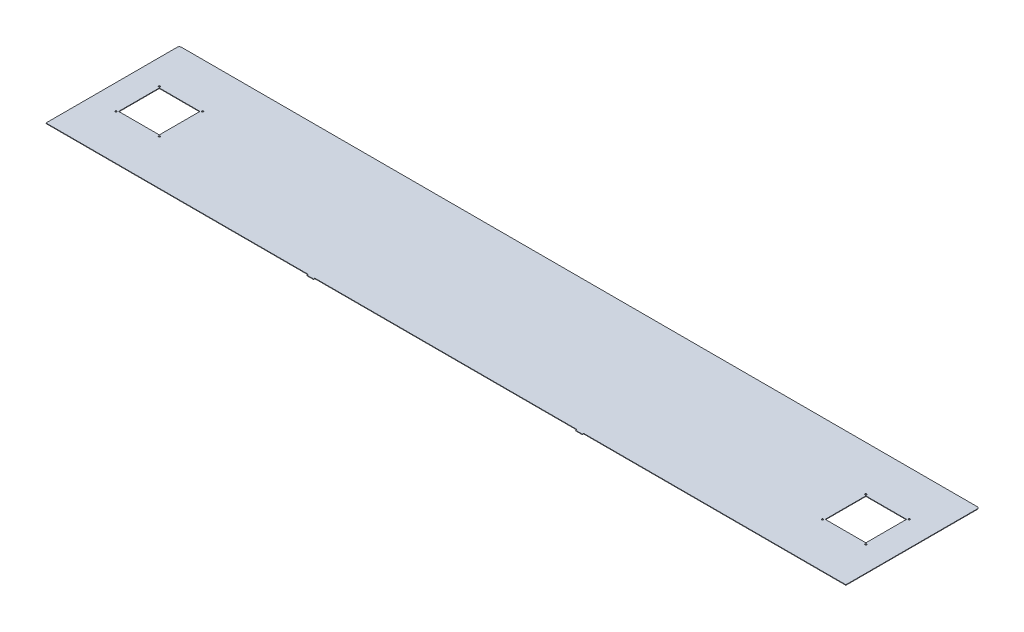
ISO-10303-21;
HEADER;
FILE_DESCRIPTION(('STEP AP214'),'2;1');
FILE_NAME('part.step','',(''),(''),'','','');
FILE_SCHEMA(('AUTOMOTIVE_DESIGN { 1 0 10303 214 1 1 1 1 }'));
ENDSEC;
DATA;
#1=APPLICATION_CONTEXT('core data for automotive mechanical design processes');
#2=APPLICATION_PROTOCOL_DEFINITION('international standard','automotive_design',2000,#1);
#3=PRODUCT_CONTEXT('',#1,'mechanical');
#4=PRODUCT('Part','Part','',(#3));
#5=PRODUCT_RELATED_PRODUCT_CATEGORY('part','',(#4));
#6=PRODUCT_DEFINITION_FORMATION('','',#4);
#7=PRODUCT_DEFINITION_CONTEXT('part definition',#1,'design');
#8=PRODUCT_DEFINITION('design','',#6,#7);
#9=PRODUCT_DEFINITION_SHAPE('','',#8);
#10=(LENGTH_UNIT() NAMED_UNIT(*) SI_UNIT(.MILLI.,.METRE.));
#11=(NAMED_UNIT(*) PLANE_ANGLE_UNIT() SI_UNIT($,.RADIAN.));
#12=(NAMED_UNIT(*) SI_UNIT($,.STERADIAN.) SOLID_ANGLE_UNIT());
#13=UNCERTAINTY_MEASURE_WITH_UNIT(LENGTH_MEASURE(1.E-05),#10,'distance_accuracy_value','');
#14=(GEOMETRIC_REPRESENTATION_CONTEXT(3) GLOBAL_UNCERTAINTY_ASSIGNED_CONTEXT((#13)) GLOBAL_UNIT_ASSIGNED_CONTEXT((#10,
#11,#12)) REPRESENTATION_CONTEXT('',''));
#15=CARTESIAN_POINT('',(0.,0.,0.));
#16=DIRECTION('',(0.,0.,1.));
#17=DIRECTION('',(1.,0.,0.));
#18=AXIS2_PLACEMENT_3D('',#15,#16,#17);
#19=CARTESIAN_POINT('',(-1200.,-1.51,-500.));
#20=DIRECTION('',(0.,0.,1.));
#21=DIRECTION('',(1.,0.,0.));
#22=AXIS2_PLACEMENT_3D('',#19,#20,#21);
#23=PLANE('',#22);
#24=DIRECTION('',(0.,1.,0.));
#25=VECTOR('',#24,1.);
#26=CARTESIAN_POINT('',(-393.333333333334,-1.5,-500.));
#27=LINE('',#26,#25);
#28=CARTESIAN_POINT('',(-393.333333333334,-1.5,-500.));
#29=VERTEX_POINT('',#28);
#30=CARTESIAN_POINT('',(-393.333333333334,0.,-500.));
#31=VERTEX_POINT('',#30);
#32=EDGE_CURVE('E191',#29,#31,#27,.T.);
#33=ORIENTED_EDGE('',*,*,#32,.F.);
#34=DIRECTION('',(1.,0.,0.));
#35=VECTOR('',#34,1.);
#36=CARTESIAN_POINT('',(0.,-1.5,-500.));
#37=LINE('',#36,#35);
#38=CARTESIAN_POINT('',(393.333333333333,-1.5,-500.));
#39=VERTEX_POINT('',#38);
#40=EDGE_CURVE('E202',#29,#39,#37,.T.);
#41=ORIENTED_EDGE('',*,*,#40,.T.);
#42=DIRECTION('',(0.,1.,0.));
#43=VECTOR('',#42,1.);
#44=CARTESIAN_POINT('',(393.333333333333,-1.5,-500.));
#45=LINE('',#44,#43);
#46=CARTESIAN_POINT('',(393.333333333333,0.,-500.));
#47=VERTEX_POINT('',#46);
#48=EDGE_CURVE('E565',#39,#47,#45,.T.);
#49=ORIENTED_EDGE('',*,*,#48,.T.);
#50=DIRECTION('',(1.,0.,0.));
#51=VECTOR('',#50,1.);
#52=CARTESIAN_POINT('',(0.,0.,-500.));
#53=LINE('',#52,#51);
#54=EDGE_CURVE('E60',#31,#47,#53,.T.);
#55=ORIENTED_EDGE('',*,*,#54,.F.);
#56=EDGE_LOOP('',(#33,#41,#49,#55));
#57=FACE_BOUND('',#56,.T.);
#58=ADVANCED_FACE('F40',(#57),#23,.T.);
#59=DIRECTION('',(0.,1.,0.));
#60=VECTOR('',#59,1.);
#61=CARTESIAN_POINT('',(-413.333333333334,-1.5,-500.));
#62=LINE('',#61,#60);
#63=CARTESIAN_POINT('',(-413.333333333334,-1.5,-500.));
#64=VERTEX_POINT('',#63);
#65=CARTESIAN_POINT('',(-413.333333333334,0.,-500.));
#66=VERTEX_POINT('',#65);
#67=EDGE_CURVE('E204',#64,#66,#62,.T.);
#68=ORIENTED_EDGE('',*,*,#67,.T.);
#69=CARTESIAN_POINT('',(-1200.,0.,-500.));
#70=VERTEX_POINT('',#69);
#71=EDGE_CURVE('E273',#70,#66,#53,.T.);
#72=ORIENTED_EDGE('',*,*,#71,.F.);
#73=DIRECTION('',(0.,1.,0.));
#74=VECTOR('',#73,1.);
#75=CARTESIAN_POINT('',(-1200.,-1.5,-500.));
#76=LINE('',#75,#74);
#77=CARTESIAN_POINT('',(-1200.,-1.5,-500.));
#78=VERTEX_POINT('',#77);
#79=EDGE_CURVE('E277',#78,#70,#76,.T.);
#80=ORIENTED_EDGE('',*,*,#79,.F.);
#81=EDGE_CURVE('E213',#78,#64,#37,.T.);
#82=ORIENTED_EDGE('',*,*,#81,.T.);
#83=EDGE_LOOP('',(#68,#72,#80,#82));
#84=FACE_BOUND('',#83,.T.);
#85=ADVANCED_FACE('F410',(#84),#23,.T.);
#86=DIRECTION('',(0.,1.,0.));
#87=VECTOR('',#86,1.);
#88=CARTESIAN_POINT('',(413.333333333333,-1.5,-500.));
#89=LINE('',#88,#87);
#90=CARTESIAN_POINT('',(413.333333333333,-1.5,-500.));
#91=VERTEX_POINT('',#90);
#92=CARTESIAN_POINT('',(413.333333333333,0.,-500.));
#93=VERTEX_POINT('',#92);
#94=EDGE_CURVE('E555',#91,#93,#89,.T.);
#95=ORIENTED_EDGE('',*,*,#94,.F.);
#96=CARTESIAN_POINT('',(1200.,-1.5,-500.));
#97=VERTEX_POINT('',#96);
#98=EDGE_CURVE('E214',#91,#97,#37,.T.);
#99=ORIENTED_EDGE('',*,*,#98,.T.);
#100=DIRECTION('',(0.,-1.,0.));
#101=VECTOR('',#100,1.);
#102=CARTESIAN_POINT('',(1200.,-1.5,-500.));
#103=LINE('',#102,#101);
#104=CARTESIAN_POINT('',(1200.,0.,-500.));
#105=VERTEX_POINT('',#104);
#106=EDGE_CURVE('E217',#105,#97,#103,.T.);
#107=ORIENTED_EDGE('',*,*,#106,.F.);
#108=EDGE_CURVE('E276',#93,#105,#53,.T.);
#109=ORIENTED_EDGE('',*,*,#108,.F.);
#110=EDGE_LOOP('',(#95,#99,#107,#109));
#111=FACE_BOUND('',#110,.T.);
#112=ADVANCED_FACE('F411',(#111),#23,.T.);
#113=CARTESIAN_POINT('',(0.,-1.5,0.));
#114=DIRECTION('',(0.,1.,0.));
#115=DIRECTION('',(0.,0.,1.));
#116=AXIS2_PLACEMENT_3D('',#113,#114,#115);
#117=PLANE('',#116);
#118=DIRECTION('',(1.,0.,0.));
#119=VECTOR('',#118,1.);
#120=CARTESIAN_POINT('',(0.,-1.5,-761.));
#121=LINE('',#120,#119);
#122=CARTESIAN_POINT('',(1121.,-1.5,-761.));
#123=VERTEX_POINT('',#122);
#124=CARTESIAN_POINT('',(998.999999999999,-1.5,-761.));
#125=VERTEX_POINT('',#124);
#126=EDGE_CURVE('E243',#123,#125,#121,.F.);
#127=ORIENTED_EDGE('',*,*,#126,.T.);
#128=DIRECTION('',(0.,0.,1.));
#129=VECTOR('',#128,1.);
#130=CARTESIAN_POINT('',(998.999999999999,-1.5,0.));
#131=LINE('',#130,#129);
#132=CARTESIAN_POINT('',(998.999999999999,-1.5,-639.));
#133=VERTEX_POINT('',#132);
#134=EDGE_CURVE('E240',#125,#133,#131,.T.);
#135=ORIENTED_EDGE('',*,*,#134,.T.);
#136=DIRECTION('',(1.,0.,0.));
#137=VECTOR('',#136,1.);
#138=CARTESIAN_POINT('',(0.,-1.5,-639.));
#139=LINE('',#138,#137);
#140=CARTESIAN_POINT('',(1121.,-1.5,-639.));
#141=VERTEX_POINT('',#140);
#142=EDGE_CURVE('E256',#133,#141,#139,.T.);
#143=ORIENTED_EDGE('',*,*,#142,.T.);
#144=DIRECTION('',(0.,0.,1.));
#145=VECTOR('',#144,1.);
#146=CARTESIAN_POINT('',(1121.,-1.5,0.));
#147=LINE('',#146,#145);
#148=EDGE_CURVE('E250',#141,#123,#147,.F.);
#149=ORIENTED_EDGE('',*,*,#148,.T.);
#150=EDGE_LOOP('',(#127,#135,#143,#149));
#151=FACE_BOUND('',#150,.T.);
#152=DIRECTION('',(1.,0.,0.));
#153=VECTOR('',#152,1.);
#154=CARTESIAN_POINT('',(0.,-1.5,-761.));
#155=LINE('',#154,#153);
#156=CARTESIAN_POINT('',(-999.,-1.5,-761.));
#157=VERTEX_POINT('',#156);
#158=CARTESIAN_POINT('',(-1121.,-1.5,-761.));
#159=VERTEX_POINT('',#158);
#160=EDGE_CURVE('E262',#157,#159,#155,.F.);
#161=ORIENTED_EDGE('',*,*,#160,.T.);
#162=DIRECTION('',(0.,0.,1.));
#163=VECTOR('',#162,1.);
#164=CARTESIAN_POINT('',(-1121.,-1.5,0.));
#165=LINE('',#164,#163);
#166=CARTESIAN_POINT('',(-1121.,-1.5,-639.));
#167=VERTEX_POINT('',#166);
#168=EDGE_CURVE('E259',#159,#167,#165,.T.);
#169=ORIENTED_EDGE('',*,*,#168,.T.);
#170=DIRECTION('',(1.,0.,0.));
#171=VECTOR('',#170,1.);
#172=CARTESIAN_POINT('',(0.,-1.5,-639.));
#173=LINE('',#172,#171);
#174=CARTESIAN_POINT('',(-999.,-1.5,-639.));
#175=VERTEX_POINT('',#174);
#176=EDGE_CURVE('E269',#167,#175,#173,.T.);
#177=ORIENTED_EDGE('',*,*,#176,.T.);
#178=DIRECTION('',(0.,0.,1.));
#179=VECTOR('',#178,1.);
#180=CARTESIAN_POINT('',(-999.,-1.5,0.));
#181=LINE('',#180,#179);
#182=EDGE_CURVE('E263',#175,#157,#181,.F.);
#183=ORIENTED_EDGE('',*,*,#182,.T.);
#184=EDGE_LOOP('',(#161,#169,#177,#183));
#185=FACE_BOUND('',#184,.T.);
#186=CARTESIAN_POINT('',(1125.,-1.5,-765.));
#187=DIRECTION('',(0.,1.,0.));
#188=DIRECTION('',(0.,0.,1.));
#189=AXIS2_PLACEMENT_3D('',#186,#187,#188);
#190=CIRCLE('',#189,2.49999999999995);
#191=CARTESIAN_POINT('',(1125.,-1.5,-762.5));
#192=VERTEX_POINT('',#191);
#193=EDGE_CURVE('E272',#192,#192,#190,.T.);
#194=ORIENTED_EDGE('',*,*,#193,.T.);
#195=EDGE_LOOP('',(#194));
#196=FACE_BOUND('',#195,.T.);
#197=CARTESIAN_POINT('',(1125.,-1.5,-635.));
#198=DIRECTION('',(0.,1.,0.));
#199=DIRECTION('',(0.,0.,1.));
#200=AXIS2_PLACEMENT_3D('',#197,#198,#199);
#201=CIRCLE('',#200,2.49999999999995);
#202=CARTESIAN_POINT('',(1125.,-1.5,-632.5));
#203=VERTEX_POINT('',#202);
#204=EDGE_CURVE('E320',#203,#203,#201,.T.);
#205=ORIENTED_EDGE('',*,*,#204,.T.);
#206=EDGE_LOOP('',(#205));
#207=FACE_BOUND('',#206,.T.);
#208=CARTESIAN_POINT('',(995.,-1.5,-635.));
#209=DIRECTION('',(0.,1.,0.));
#210=DIRECTION('',(0.,0.,1.));
#211=AXIS2_PLACEMENT_3D('',#208,#209,#210);
#212=CIRCLE('',#211,2.49999999999995);
#213=CARTESIAN_POINT('',(995.,-1.5,-632.5));
#214=VERTEX_POINT('',#213);
#215=EDGE_CURVE('E323',#214,#214,#212,.T.);
#216=ORIENTED_EDGE('',*,*,#215,.T.);
#217=EDGE_LOOP('',(#216));
#218=FACE_BOUND('',#217,.T.);
#219=CARTESIAN_POINT('',(995.,-1.5,-765.));
#220=DIRECTION('',(0.,1.,0.));
#221=DIRECTION('',(0.,0.,1.));
#222=AXIS2_PLACEMENT_3D('',#219,#220,#221);
#223=CIRCLE('',#222,2.49999999999995);
#224=CARTESIAN_POINT('',(995.,-1.5,-762.5));
#225=VERTEX_POINT('',#224);
#226=EDGE_CURVE('E326',#225,#225,#223,.T.);
#227=ORIENTED_EDGE('',*,*,#226,.T.);
#228=EDGE_LOOP('',(#227));
#229=FACE_BOUND('',#228,.T.);
#230=CARTESIAN_POINT('',(-995.,-1.5,-634.999999999999));
#231=DIRECTION('',(0.,1.,0.));
#232=DIRECTION('',(0.,0.,1.));
#233=AXIS2_PLACEMENT_3D('',#230,#231,#232);
#234=CIRCLE('',#233,2.49999999999995);
#235=CARTESIAN_POINT('',(-995.,-1.5,-632.499999999999));
#236=VERTEX_POINT('',#235);
#237=EDGE_CURVE('E329',#236,#236,#234,.T.);
#238=ORIENTED_EDGE('',*,*,#237,.T.);
#239=EDGE_LOOP('',(#238));
#240=FACE_BOUND('',#239,.T.);
#241=CARTESIAN_POINT('',(-995.,-1.5,-764.999999999999));
#242=DIRECTION('',(0.,1.,0.));
#243=DIRECTION('',(0.,0.,1.));
#244=AXIS2_PLACEMENT_3D('',#241,#242,#243);
#245=CIRCLE('',#244,2.49999999999995);
#246=CARTESIAN_POINT('',(-995.,-1.5,-762.499999999999));
#247=VERTEX_POINT('',#246);
#248=EDGE_CURVE('E332',#247,#247,#245,.T.);
#249=ORIENTED_EDGE('',*,*,#248,.T.);
#250=EDGE_LOOP('',(#249));
#251=FACE_BOUND('',#250,.T.);
#252=CARTESIAN_POINT('',(-1125.,-1.5,-764.999999999999));
#253=DIRECTION('',(0.,1.,0.));
#254=DIRECTION('',(0.,0.,1.));
#255=AXIS2_PLACEMENT_3D('',#252,#253,#254);
#256=CIRCLE('',#255,2.49999999999995);
#257=CARTESIAN_POINT('',(-1125.,-1.5,-762.499999999999));
#258=VERTEX_POINT('',#257);
#259=EDGE_CURVE('E335',#258,#258,#256,.T.);
#260=ORIENTED_EDGE('',*,*,#259,.T.);
#261=EDGE_LOOP('',(#260));
#262=FACE_BOUND('',#261,.T.);
#263=CARTESIAN_POINT('',(-1125.,-1.5,-634.999999999999));
#264=DIRECTION('',(0.,1.,0.));
#265=DIRECTION('',(0.,0.,1.));
#266=AXIS2_PLACEMENT_3D('',#263,#264,#265);
#267=CIRCLE('',#266,2.49999999999995);
#268=CARTESIAN_POINT('',(-1125.,-1.5,-632.499999999999));
#269=VERTEX_POINT('',#268);
#270=EDGE_CURVE('E228',#269,#269,#267,.T.);
#271=ORIENTED_EDGE('',*,*,#270,.T.);
#272=EDGE_LOOP('',(#271));
#273=FACE_BOUND('',#272,.T.);
#274=ORIENTED_EDGE('',*,*,#81,.F.);
#275=DIRECTION('',(0.,0.,1.));
#276=VECTOR('',#275,1.);
#277=CARTESIAN_POINT('',(-1200.,-1.5,-900.));
#278=LINE('',#277,#276);
#279=CARTESIAN_POINT('',(-1200.,-1.5,-894.));
#280=VERTEX_POINT('',#279);
#281=EDGE_CURVE('E230',#280,#78,#278,.T.);
#282=ORIENTED_EDGE('',*,*,#281,.F.);
#283=CARTESIAN_POINT('',(-1194.,-1.5,-894.));
#284=DIRECTION('',(0.,1.,0.));
#285=DIRECTION('',(0.,0.,1.));
#286=AXIS2_PLACEMENT_3D('',#283,#284,#285);
#287=CIRCLE('',#286,6.00000000000001);
#288=CARTESIAN_POINT('',(-1194.,-1.5,-900.));
#289=VERTEX_POINT('',#288);
#290=EDGE_CURVE('E232',#289,#280,#287,.T.);
#291=ORIENTED_EDGE('',*,*,#290,.F.);
#292=DIRECTION('',(-1.,0.,0.));
#293=VECTOR('',#292,1.);
#294=CARTESIAN_POINT('',(-1200.,-1.5,-900.));
#295=LINE('',#294,#293);
#296=CARTESIAN_POINT('',(1194.,-1.5,-900.));
#297=VERTEX_POINT('',#296);
#298=EDGE_CURVE('E294',#297,#289,#295,.T.);
#299=ORIENTED_EDGE('',*,*,#298,.F.);
#300=CARTESIAN_POINT('',(1194.,-1.5,-894.));
#301=DIRECTION('',(0.,1.,0.));
#302=DIRECTION('',(0.,0.,1.));
#303=AXIS2_PLACEMENT_3D('',#300,#301,#302);
#304=CIRCLE('',#303,6.00000000000001);
#305=CARTESIAN_POINT('',(1200.,-1.5,-894.));
#306=VERTEX_POINT('',#305);
#307=EDGE_CURVE('E291',#306,#297,#304,.T.);
#308=ORIENTED_EDGE('',*,*,#307,.F.);
#309=DIRECTION('',(0.,0.,-1.));
#310=VECTOR('',#309,1.);
#311=CARTESIAN_POINT('',(1200.,-1.5,-900.));
#312=LINE('',#311,#310);
#313=EDGE_CURVE('E11',#97,#306,#312,.T.);
#314=ORIENTED_EDGE('',*,*,#313,.F.);
#315=ORIENTED_EDGE('',*,*,#98,.F.);
#316=DIRECTION('',(0.,0.,-1.));
#317=VECTOR('',#316,1.);
#318=CARTESIAN_POINT('',(413.333333333333,-1.5,-500.));
#319=LINE('',#318,#317);
#320=CARTESIAN_POINT('',(413.333333333333,-1.5,-496.));
#321=VERTEX_POINT('',#320);
#322=EDGE_CURVE('E548',#321,#91,#319,.T.);
#323=ORIENTED_EDGE('',*,*,#322,.F.);
#324=DIRECTION('',(1.,0.,0.));
#325=VECTOR('',#324,1.);
#326=CARTESIAN_POINT('',(413.333333333333,-1.5,-496.));
#327=LINE('',#326,#325);
#328=CARTESIAN_POINT('',(393.333333333333,-1.5,-496.));
#329=VERTEX_POINT('',#328);
#330=EDGE_CURVE('E552',#329,#321,#327,.T.);
#331=ORIENTED_EDGE('',*,*,#330,.F.);
#332=DIRECTION('',(0.,0.,1.));
#333=VECTOR('',#332,1.);
#334=CARTESIAN_POINT('',(393.333333333333,-1.5,-500.));
#335=LINE('',#334,#333);
#336=EDGE_CURVE('E212',#39,#329,#335,.T.);
#337=ORIENTED_EDGE('',*,*,#336,.F.);
#338=ORIENTED_EDGE('',*,*,#40,.F.);
#339=DIRECTION('',(0.,0.,-1.));
#340=VECTOR('',#339,1.);
#341=CARTESIAN_POINT('',(-393.333333333334,-1.5,-500.));
#342=LINE('',#341,#340);
#343=CARTESIAN_POINT('',(-393.333333333334,-1.5,-496.));
#344=VERTEX_POINT('',#343);
#345=EDGE_CURVE('E188',#344,#29,#342,.T.);
#346=ORIENTED_EDGE('',*,*,#345,.F.);
#347=DIRECTION('',(1.,0.,0.));
#348=VECTOR('',#347,1.);
#349=CARTESIAN_POINT('',(-393.333333333334,-1.5,-496.));
#350=LINE('',#349,#348);
#351=CARTESIAN_POINT('',(-413.333333333334,-1.5,-496.));
#352=VERTEX_POINT('',#351);
#353=EDGE_CURVE('E205',#352,#344,#350,.T.);
#354=ORIENTED_EDGE('',*,*,#353,.F.);
#355=DIRECTION('',(0.,0.,1.));
#356=VECTOR('',#355,1.);
#357=CARTESIAN_POINT('',(-413.333333333334,-1.5,-500.));
#358=LINE('',#357,#356);
#359=EDGE_CURVE('E197',#64,#352,#358,.T.);
#360=ORIENTED_EDGE('',*,*,#359,.F.);
#361=EDGE_LOOP('',(#274,#282,#291,#299,#308,#314,#315,#323,#331,#337,#338,#346,#354,#360));
#362=FACE_BOUND('',#361,.T.);
#363=ADVANCED_FACE('F209',(#151,#185,#196,#207,#218,#229,#240,#251,#262,#273,#362),#117,.F.);
#364=CARTESIAN_POINT('',(-1194.,-1.5,-894.));
#365=DIRECTION('',(0.,1.,0.));
#366=DIRECTION('',(0.,0.,1.));
#367=AXIS2_PLACEMENT_3D('',#364,#365,#366);
#368=CYLINDRICAL_SURFACE('',#367,6.00000000000001);
#369=ORIENTED_EDGE('',*,*,#290,.T.);
#370=DIRECTION('',(0.,1.,0.));
#371=VECTOR('',#370,1.);
#372=CARTESIAN_POINT('',(-1200.,-1.5,-894.));
#373=LINE('',#372,#371);
#374=CARTESIAN_POINT('',(-1200.,0.,-894.));
#375=VERTEX_POINT('',#374);
#376=EDGE_CURVE('E233',#375,#280,#373,.F.);
#377=ORIENTED_EDGE('',*,*,#376,.F.);
#378=CARTESIAN_POINT('',(-1194.,0.,-894.));
#379=DIRECTION('',(0.,1.,0.));
#380=DIRECTION('',(0.,0.,1.));
#381=AXIS2_PLACEMENT_3D('',#378,#379,#380);
#382=CIRCLE('',#381,6.00000000000001);
#383=CARTESIAN_POINT('',(-1194.,0.,-900.));
#384=VERTEX_POINT('',#383);
#385=EDGE_CURVE('E225',#384,#375,#382,.T.);
#386=ORIENTED_EDGE('',*,*,#385,.F.);
#387=DIRECTION('',(0.,1.,0.));
#388=VECTOR('',#387,1.);
#389=CARTESIAN_POINT('',(-1194.,-1.5,-900.));
#390=LINE('',#389,#388);
#391=EDGE_CURVE('E238',#384,#289,#390,.F.);
#392=ORIENTED_EDGE('',*,*,#391,.T.);
#393=EDGE_LOOP('',(#369,#377,#386,#392));
#394=FACE_BOUND('',#393,.T.);
#395=ADVANCED_FACE('F422',(#394),#368,.T.);
#396=CARTESIAN_POINT('',(-1200.,-1.5,-900.));
#397=DIRECTION('',(0.,0.,-1.));
#398=DIRECTION('',(-1.,0.,0.));
#399=AXIS2_PLACEMENT_3D('',#396,#397,#398);
#400=PLANE('',#399);
#401=ORIENTED_EDGE('',*,*,#298,.T.);
#402=ORIENTED_EDGE('',*,*,#391,.F.);
#403=DIRECTION('',(1.,0.,0.));
#404=VECTOR('',#403,1.);
#405=CARTESIAN_POINT('',(0.,0.,-900.));
#406=LINE('',#405,#404);
#407=CARTESIAN_POINT('',(1194.,0.,-900.));
#408=VERTEX_POINT('',#407);
#409=EDGE_CURVE('E341',#408,#384,#406,.F.);
#410=ORIENTED_EDGE('',*,*,#409,.F.);
#411=DIRECTION('',(0.,1.,0.));
#412=VECTOR('',#411,1.);
#413=CARTESIAN_POINT('',(1194.,-1.5,-900.));
#414=LINE('',#413,#412);
#415=EDGE_CURVE('E297',#408,#297,#414,.F.);
#416=ORIENTED_EDGE('',*,*,#415,.T.);
#417=EDGE_LOOP('',(#401,#402,#410,#416));
#418=FACE_BOUND('',#417,.T.);
#419=ADVANCED_FACE('F510',(#418),#400,.T.);
#420=CARTESIAN_POINT('',(1194.,-1.5,-894.));
#421=DIRECTION('',(0.,1.,0.));
#422=DIRECTION('',(0.,0.,1.));
#423=AXIS2_PLACEMENT_3D('',#420,#421,#422);
#424=CYLINDRICAL_SURFACE('',#423,6.00000000000001);
#425=ORIENTED_EDGE('',*,*,#307,.T.);
#426=ORIENTED_EDGE('',*,*,#415,.F.);
#427=CARTESIAN_POINT('',(1194.,0.,-894.));
#428=DIRECTION('',(0.,1.,0.));
#429=DIRECTION('',(0.,0.,1.));
#430=AXIS2_PLACEMENT_3D('',#427,#428,#429);
#431=CIRCLE('',#430,6.00000000000001);
#432=CARTESIAN_POINT('',(1200.,0.,-894.));
#433=VERTEX_POINT('',#432);
#434=EDGE_CURVE('E229',#433,#408,#431,.T.);
#435=ORIENTED_EDGE('',*,*,#434,.F.);
#436=DIRECTION('',(0.,1.,0.));
#437=VECTOR('',#436,1.);
#438=CARTESIAN_POINT('',(1200.,-1.5,-894.));
#439=LINE('',#438,#437);
#440=EDGE_CURVE('E48',#433,#306,#439,.F.);
#441=ORIENTED_EDGE('',*,*,#440,.T.);
#442=EDGE_LOOP('',(#425,#426,#435,#441));
#443=FACE_BOUND('',#442,.T.);
#444=ADVANCED_FACE('F300',(#443),#424,.T.);
#445=CARTESIAN_POINT('',(1200.,-1.5,-900.));
#446=DIRECTION('',(1.,0.,0.));
#447=DIRECTION('',(0.,0.,-1.));
#448=AXIS2_PLACEMENT_3D('',#445,#446,#447);
#449=PLANE('',#448);
#450=DIRECTION('',(0.,0.,1.));
#451=VECTOR('',#450,1.);
#452=CARTESIAN_POINT('',(1200.,0.,0.));
#453=LINE('',#452,#451);
#454=EDGE_CURVE('E227',#105,#433,#453,.F.);
#455=ORIENTED_EDGE('',*,*,#454,.F.);
#456=ORIENTED_EDGE('',*,*,#106,.T.);
#457=ORIENTED_EDGE('',*,*,#313,.T.);
#458=ORIENTED_EDGE('',*,*,#440,.F.);
#459=EDGE_LOOP('',(#455,#456,#457,#458));
#460=FACE_BOUND('',#459,.T.);
#461=ADVANCED_FACE('F283',(#460),#449,.T.);
#462=CARTESIAN_POINT('',(-1200.,-1.5,-900.));
#463=DIRECTION('',(-1.,0.,0.));
#464=DIRECTION('',(0.,0.,1.));
#465=AXIS2_PLACEMENT_3D('',#462,#463,#464);
#466=PLANE('',#465);
#467=ORIENTED_EDGE('',*,*,#281,.T.);
#468=ORIENTED_EDGE('',*,*,#79,.T.);
#469=DIRECTION('',(0.,0.,1.));
#470=VECTOR('',#469,1.);
#471=CARTESIAN_POINT('',(-1200.,0.,0.));
#472=LINE('',#471,#470);
#473=EDGE_CURVE('E222',#375,#70,#472,.T.);
#474=ORIENTED_EDGE('',*,*,#473,.F.);
#475=ORIENTED_EDGE('',*,*,#376,.T.);
#476=EDGE_LOOP('',(#467,#468,#474,#475));
#477=FACE_BOUND('',#476,.T.);
#478=ADVANCED_FACE('F397',(#477),#466,.T.);
#479=CARTESIAN_POINT('',(-1125.,-10.,-634.999999999999));
#480=DIRECTION('',(0.,1.,0.));
#481=DIRECTION('',(0.,0.,1.));
#482=AXIS2_PLACEMENT_3D('',#479,#480,#481);
#483=CYLINDRICAL_SURFACE('',#482,2.49999999999995);
#484=ORIENTED_EDGE('',*,*,#270,.F.);
#485=EDGE_LOOP('',(#484));
#486=FACE_BOUND('',#485,.T.);
#487=CARTESIAN_POINT('',(-1125.,0.,-634.999999999999));
#488=DIRECTION('',(0.,1.,0.));
#489=DIRECTION('',(0.,0.,1.));
#490=AXIS2_PLACEMENT_3D('',#487,#488,#489);
#491=CIRCLE('',#490,2.49999999999995);
#492=CARTESIAN_POINT('',(-1125.,0.,-632.499999999999));
#493=VERTEX_POINT('',#492);
#494=EDGE_CURVE('E275',#493,#493,#491,.F.);
#495=ORIENTED_EDGE('',*,*,#494,.F.);
#496=EDGE_LOOP('',(#495));
#497=FACE_BOUND('',#496,.T.);
#498=ADVANCED_FACE('F394',(#486,#497),#483,.F.);
#499=CARTESIAN_POINT('',(-1125.,-10.,-764.999999999999));
#500=DIRECTION('',(0.,1.,0.));
#501=DIRECTION('',(0.,0.,1.));
#502=AXIS2_PLACEMENT_3D('',#499,#500,#501);
#503=CYLINDRICAL_SURFACE('',#502,2.49999999999995);
#504=ORIENTED_EDGE('',*,*,#259,.F.);
#505=EDGE_LOOP('',(#504));
#506=FACE_BOUND('',#505,.T.);
#507=CARTESIAN_POINT('',(-1125.,0.,-764.999999999999));
#508=DIRECTION('',(0.,1.,0.));
#509=DIRECTION('',(0.,0.,1.));
#510=AXIS2_PLACEMENT_3D('',#507,#508,#509);
#511=CIRCLE('',#510,2.49999999999995);
#512=CARTESIAN_POINT('',(-1125.,0.,-762.499999999999));
#513=VERTEX_POINT('',#512);
#514=EDGE_CURVE('E386',#513,#513,#511,.F.);
#515=ORIENTED_EDGE('',*,*,#514,.F.);
#516=EDGE_LOOP('',(#515));
#517=FACE_BOUND('',#516,.T.);
#518=ADVANCED_FACE('F396',(#506,#517),#503,.F.);
#519=CARTESIAN_POINT('',(-995.,-10.,-764.999999999999));
#520=DIRECTION('',(0.,1.,0.));
#521=DIRECTION('',(0.,0.,1.));
#522=AXIS2_PLACEMENT_3D('',#519,#520,#521);
#523=CYLINDRICAL_SURFACE('',#522,2.49999999999995);
#524=ORIENTED_EDGE('',*,*,#248,.F.);
#525=EDGE_LOOP('',(#524));
#526=FACE_BOUND('',#525,.T.);
#527=CARTESIAN_POINT('',(-995.,0.,-764.999999999999));
#528=DIRECTION('',(0.,1.,0.));
#529=DIRECTION('',(0.,0.,1.));
#530=AXIS2_PLACEMENT_3D('',#527,#528,#529);
#531=CIRCLE('',#530,2.49999999999995);
#532=CARTESIAN_POINT('',(-995.,0.,-762.499999999999));
#533=VERTEX_POINT('',#532);
#534=EDGE_CURVE('E384',#533,#533,#531,.F.);
#535=ORIENTED_EDGE('',*,*,#534,.F.);
#536=EDGE_LOOP('',(#535));
#537=FACE_BOUND('',#536,.T.);
#538=ADVANCED_FACE('F404',(#526,#537),#523,.F.);
#539=CARTESIAN_POINT('',(-995.,-10.,-634.999999999999));
#540=DIRECTION('',(0.,1.,0.));
#541=DIRECTION('',(0.,0.,1.));
#542=AXIS2_PLACEMENT_3D('',#539,#540,#541);
#543=CYLINDRICAL_SURFACE('',#542,2.49999999999995);
#544=ORIENTED_EDGE('',*,*,#237,.F.);
#545=EDGE_LOOP('',(#544));
#546=FACE_BOUND('',#545,.T.);
#547=CARTESIAN_POINT('',(-995.,0.,-634.999999999999));
#548=DIRECTION('',(0.,1.,0.));
#549=DIRECTION('',(0.,0.,1.));
#550=AXIS2_PLACEMENT_3D('',#547,#548,#549);
#551=CIRCLE('',#550,2.49999999999995);
#552=CARTESIAN_POINT('',(-995.,0.,-632.499999999999));
#553=VERTEX_POINT('',#552);
#554=EDGE_CURVE('E381',#553,#553,#551,.F.);
#555=ORIENTED_EDGE('',*,*,#554,.F.);
#556=EDGE_LOOP('',(#555));
#557=FACE_BOUND('',#556,.T.);
#558=ADVANCED_FACE('F455',(#546,#557),#543,.F.);
#559=CARTESIAN_POINT('',(995.,-10.,-765.));
#560=DIRECTION('',(0.,1.,0.));
#561=DIRECTION('',(0.,0.,1.));
#562=AXIS2_PLACEMENT_3D('',#559,#560,#561);
#563=CYLINDRICAL_SURFACE('',#562,2.49999999999995);
#564=ORIENTED_EDGE('',*,*,#226,.F.);
#565=EDGE_LOOP('',(#564));
#566=FACE_BOUND('',#565,.T.);
#567=CARTESIAN_POINT('',(995.,0.,-765.));
#568=DIRECTION('',(0.,1.,0.));
#569=DIRECTION('',(0.,0.,1.));
#570=AXIS2_PLACEMENT_3D('',#567,#568,#569);
#571=CIRCLE('',#570,2.49999999999995);
#572=CARTESIAN_POINT('',(995.,0.,-762.5));
#573=VERTEX_POINT('',#572);
#574=EDGE_CURVE('E378',#573,#573,#571,.F.);
#575=ORIENTED_EDGE('',*,*,#574,.F.);
#576=EDGE_LOOP('',(#575));
#577=FACE_BOUND('',#576,.T.);
#578=ADVANCED_FACE('F461',(#566,#577),#563,.F.);
#579=CARTESIAN_POINT('',(995.,-10.,-635.));
#580=DIRECTION('',(0.,1.,0.));
#581=DIRECTION('',(0.,0.,1.));
#582=AXIS2_PLACEMENT_3D('',#579,#580,#581);
#583=CYLINDRICAL_SURFACE('',#582,2.49999999999995);
#584=ORIENTED_EDGE('',*,*,#215,.F.);
#585=EDGE_LOOP('',(#584));
#586=FACE_BOUND('',#585,.T.);
#587=CARTESIAN_POINT('',(995.,0.,-635.));
#588=DIRECTION('',(0.,1.,0.));
#589=DIRECTION('',(0.,0.,1.));
#590=AXIS2_PLACEMENT_3D('',#587,#588,#589);
#591=CIRCLE('',#590,2.49999999999995);
#592=CARTESIAN_POINT('',(995.,0.,-632.5));
#593=VERTEX_POINT('',#592);
#594=EDGE_CURVE('E375',#593,#593,#591,.F.);
#595=ORIENTED_EDGE('',*,*,#594,.F.);
#596=EDGE_LOOP('',(#595));
#597=FACE_BOUND('',#596,.T.);
#598=ADVANCED_FACE('F468',(#586,#597),#583,.F.);
#599=CARTESIAN_POINT('',(1125.,-10.,-635.));
#600=DIRECTION('',(0.,1.,0.));
#601=DIRECTION('',(0.,0.,1.));
#602=AXIS2_PLACEMENT_3D('',#599,#600,#601);
#603=CYLINDRICAL_SURFACE('',#602,2.49999999999995);
#604=ORIENTED_EDGE('',*,*,#204,.F.);
#605=EDGE_LOOP('',(#604));
#606=FACE_BOUND('',#605,.T.);
#607=CARTESIAN_POINT('',(1125.,0.,-635.));
#608=DIRECTION('',(0.,1.,0.));
#609=DIRECTION('',(0.,0.,1.));
#610=AXIS2_PLACEMENT_3D('',#607,#608,#609);
#611=CIRCLE('',#610,2.49999999999995);
#612=CARTESIAN_POINT('',(1125.,0.,-632.5));
#613=VERTEX_POINT('',#612);
#614=EDGE_CURVE('E372',#613,#613,#611,.F.);
#615=ORIENTED_EDGE('',*,*,#614,.F.);
#616=EDGE_LOOP('',(#615));
#617=FACE_BOUND('',#616,.T.);
#618=ADVANCED_FACE('F472',(#606,#617),#603,.F.);
#619=CARTESIAN_POINT('',(1125.,-10.,-765.));
#620=DIRECTION('',(0.,1.,0.));
#621=DIRECTION('',(0.,0.,1.));
#622=AXIS2_PLACEMENT_3D('',#619,#620,#621);
#623=CYLINDRICAL_SURFACE('',#622,2.49999999999995);
#624=ORIENTED_EDGE('',*,*,#193,.F.);
#625=EDGE_LOOP('',(#624));
#626=FACE_BOUND('',#625,.T.);
#627=CARTESIAN_POINT('',(1125.,0.,-765.));
#628=DIRECTION('',(0.,1.,0.));
#629=DIRECTION('',(0.,0.,1.));
#630=AXIS2_PLACEMENT_3D('',#627,#628,#629);
#631=CIRCLE('',#630,2.49999999999995);
#632=CARTESIAN_POINT('',(1125.,0.,-762.5));
#633=VERTEX_POINT('',#632);
#634=EDGE_CURVE('E369',#633,#633,#631,.F.);
#635=ORIENTED_EDGE('',*,*,#634,.F.);
#636=EDGE_LOOP('',(#635));
#637=FACE_BOUND('',#636,.T.);
#638=ADVANCED_FACE('F476',(#626,#637),#623,.F.);
#639=CARTESIAN_POINT('',(-999.,-10.,-761.));
#640=DIRECTION('',(0.,0.,-1.));
#641=DIRECTION('',(-1.,0.,0.));
#642=AXIS2_PLACEMENT_3D('',#639,#640,#641);
#643=PLANE('',#642);
#644=DIRECTION('',(0.,1.,0.));
#645=VECTOR('',#644,1.);
#646=CARTESIAN_POINT('',(-1121.,-10.,-761.));
#647=LINE('',#646,#645);
#648=CARTESIAN_POINT('',(-1121.,0.,-761.));
#649=VERTEX_POINT('',#648);
#650=EDGE_CURVE('E260',#159,#649,#647,.T.);
#651=ORIENTED_EDGE('',*,*,#650,.F.);
#652=ORIENTED_EDGE('',*,*,#160,.F.);
#653=DIRECTION('',(0.,1.,0.));
#654=VECTOR('',#653,1.);
#655=CARTESIAN_POINT('',(-999.,-10.,-761.));
#656=LINE('',#655,#654);
#657=CARTESIAN_POINT('',(-999.,0.,-761.));
#658=VERTEX_POINT('',#657);
#659=EDGE_CURVE('E264',#157,#658,#656,.T.);
#660=ORIENTED_EDGE('',*,*,#659,.T.);
#661=DIRECTION('',(1.,0.,0.));
#662=VECTOR('',#661,1.);
#663=CARTESIAN_POINT('',(0.,0.,-761.));
#664=LINE('',#663,#662);
#665=EDGE_CURVE('E360',#649,#658,#664,.T.);
#666=ORIENTED_EDGE('',*,*,#665,.F.);
#667=EDGE_LOOP('',(#651,#652,#660,#666));
#668=FACE_BOUND('',#667,.T.);
#669=ADVANCED_FACE('F480',(#668),#643,.F.);
#670=CARTESIAN_POINT('',(-1121.,-10.,-761.));
#671=DIRECTION('',(-1.,0.,0.));
#672=DIRECTION('',(0.,0.,1.));
#673=AXIS2_PLACEMENT_3D('',#670,#671,#672);
#674=PLANE('',#673);
#675=DIRECTION('',(0.,1.,0.));
#676=VECTOR('',#675,1.);
#677=CARTESIAN_POINT('',(-1121.,-10.,-639.));
#678=LINE('',#677,#676);
#679=CARTESIAN_POINT('',(-1121.,0.,-639.));
#680=VERTEX_POINT('',#679);
#681=EDGE_CURVE('E266',#680,#167,#678,.F.);
#682=ORIENTED_EDGE('',*,*,#681,.T.);
#683=ORIENTED_EDGE('',*,*,#168,.F.);
#684=ORIENTED_EDGE('',*,*,#650,.T.);
#685=DIRECTION('',(0.,0.,1.));
#686=VECTOR('',#685,1.);
#687=CARTESIAN_POINT('',(-1121.,0.,0.));
#688=LINE('',#687,#686);
#689=EDGE_CURVE('E357',#680,#649,#688,.F.);
#690=ORIENTED_EDGE('',*,*,#689,.F.);
#691=EDGE_LOOP('',(#682,#683,#684,#690));
#692=FACE_BOUND('',#691,.T.);
#693=ADVANCED_FACE('F486',(#692),#674,.F.);
#694=CARTESIAN_POINT('',(-999.,-10.,-639.));
#695=DIRECTION('',(0.,0.,1.));
#696=DIRECTION('',(1.,0.,0.));
#697=AXIS2_PLACEMENT_3D('',#694,#695,#696);
#698=PLANE('',#697);
#699=DIRECTION('',(0.,1.,0.));
#700=VECTOR('',#699,1.);
#701=CARTESIAN_POINT('',(-999.,-10.,-639.));
#702=LINE('',#701,#700);
#703=CARTESIAN_POINT('',(-999.,0.,-639.));
#704=VERTEX_POINT('',#703);
#705=EDGE_CURVE('E270',#175,#704,#702,.T.);
#706=ORIENTED_EDGE('',*,*,#705,.F.);
#707=ORIENTED_EDGE('',*,*,#176,.F.);
#708=ORIENTED_EDGE('',*,*,#681,.F.);
#709=DIRECTION('',(1.,0.,0.));
#710=VECTOR('',#709,1.);
#711=CARTESIAN_POINT('',(0.,0.,-639.));
#712=LINE('',#711,#710);
#713=EDGE_CURVE('E366',#704,#680,#712,.F.);
#714=ORIENTED_EDGE('',*,*,#713,.F.);
#715=EDGE_LOOP('',(#706,#707,#708,#714));
#716=FACE_BOUND('',#715,.T.);
#717=ADVANCED_FACE('F482',(#716),#698,.F.);
#718=CARTESIAN_POINT('',(-999.,-10.,-761.));
#719=DIRECTION('',(1.,0.,0.));
#720=DIRECTION('',(0.,0.,-1.));
#721=AXIS2_PLACEMENT_3D('',#718,#719,#720);
#722=PLANE('',#721);
#723=ORIENTED_EDGE('',*,*,#659,.F.);
#724=ORIENTED_EDGE('',*,*,#182,.F.);
#725=ORIENTED_EDGE('',*,*,#705,.T.);
#726=DIRECTION('',(0.,0.,1.));
#727=VECTOR('',#726,1.);
#728=CARTESIAN_POINT('',(-999.,0.,0.));
#729=LINE('',#728,#727);
#730=EDGE_CURVE('E363',#658,#704,#729,.T.);
#731=ORIENTED_EDGE('',*,*,#730,.F.);
#732=EDGE_LOOP('',(#723,#724,#725,#731));
#733=FACE_BOUND('',#732,.T.);
#734=ADVANCED_FACE('F485',(#733),#722,.F.);
#735=CARTESIAN_POINT('',(998.999999999999,-10.,-761.));
#736=DIRECTION('',(0.,0.,-1.));
#737=DIRECTION('',(-1.,0.,0.));
#738=AXIS2_PLACEMENT_3D('',#735,#736,#737);
#739=PLANE('',#738);
#740=DIRECTION('',(0.,1.,0.));
#741=VECTOR('',#740,1.);
#742=CARTESIAN_POINT('',(998.999999999999,-10.,-761.));
#743=LINE('',#742,#741);
#744=CARTESIAN_POINT('',(998.999999999999,0.,-761.));
#745=VERTEX_POINT('',#744);
#746=EDGE_CURVE('E248',#125,#745,#743,.T.);
#747=ORIENTED_EDGE('',*,*,#746,.F.);
#748=ORIENTED_EDGE('',*,*,#126,.F.);
#749=DIRECTION('',(0.,1.,0.));
#750=VECTOR('',#749,1.);
#751=CARTESIAN_POINT('',(1121.,-10.,-761.));
#752=LINE('',#751,#750);
#753=CARTESIAN_POINT('',(1121.,0.,-761.));
#754=VERTEX_POINT('',#753);
#755=EDGE_CURVE('E251',#123,#754,#752,.T.);
#756=ORIENTED_EDGE('',*,*,#755,.T.);
#757=DIRECTION('',(1.,0.,0.));
#758=VECTOR('',#757,1.);
#759=CARTESIAN_POINT('',(0.,0.,-761.));
#760=LINE('',#759,#758);
#761=EDGE_CURVE('E348',#745,#754,#760,.T.);
#762=ORIENTED_EDGE('',*,*,#761,.F.);
#763=EDGE_LOOP('',(#747,#748,#756,#762));
#764=FACE_BOUND('',#763,.T.);
#765=ADVANCED_FACE('F490',(#764),#739,.F.);
#766=CARTESIAN_POINT('',(998.999999999999,-10.,-761.));
#767=DIRECTION('',(-1.,0.,0.));
#768=DIRECTION('',(0.,0.,1.));
#769=AXIS2_PLACEMENT_3D('',#766,#767,#768);
#770=PLANE('',#769);
#771=DIRECTION('',(0.,1.,0.));
#772=VECTOR('',#771,1.);
#773=CARTESIAN_POINT('',(998.999999999999,-10.,-639.));
#774=LINE('',#773,#772);
#775=CARTESIAN_POINT('',(998.999999999999,0.,-639.));
#776=VERTEX_POINT('',#775);
#777=EDGE_CURVE('E253',#776,#133,#774,.F.);
#778=ORIENTED_EDGE('',*,*,#777,.T.);
#779=ORIENTED_EDGE('',*,*,#134,.F.);
#780=ORIENTED_EDGE('',*,*,#746,.T.);
#781=DIRECTION('',(0.,0.,1.));
#782=VECTOR('',#781,1.);
#783=CARTESIAN_POINT('',(998.999999999999,0.,0.));
#784=LINE('',#783,#782);
#785=EDGE_CURVE('E226',#776,#745,#784,.F.);
#786=ORIENTED_EDGE('',*,*,#785,.F.);
#787=EDGE_LOOP('',(#778,#779,#780,#786));
#788=FACE_BOUND('',#787,.T.);
#789=ADVANCED_FACE('F499',(#788),#770,.F.);
#790=CARTESIAN_POINT('',(998.999999999999,-10.,-639.));
#791=DIRECTION('',(0.,0.,1.));
#792=DIRECTION('',(1.,0.,0.));
#793=AXIS2_PLACEMENT_3D('',#790,#791,#792);
#794=PLANE('',#793);
#795=DIRECTION('',(0.,1.,0.));
#796=VECTOR('',#795,1.);
#797=CARTESIAN_POINT('',(1121.,-10.,-639.));
#798=LINE('',#797,#796);
#799=CARTESIAN_POINT('',(1121.,0.,-639.));
#800=VERTEX_POINT('',#799);
#801=EDGE_CURVE('E257',#141,#800,#798,.T.);
#802=ORIENTED_EDGE('',*,*,#801,.F.);
#803=ORIENTED_EDGE('',*,*,#142,.F.);
#804=ORIENTED_EDGE('',*,*,#777,.F.);
#805=DIRECTION('',(1.,0.,0.));
#806=VECTOR('',#805,1.);
#807=CARTESIAN_POINT('',(0.,0.,-639.));
#808=LINE('',#807,#806);
#809=EDGE_CURVE('E354',#800,#776,#808,.F.);
#810=ORIENTED_EDGE('',*,*,#809,.F.);
#811=EDGE_LOOP('',(#802,#803,#804,#810));
#812=FACE_BOUND('',#811,.T.);
#813=ADVANCED_FACE('F435',(#812),#794,.F.);
#814=CARTESIAN_POINT('',(1121.,-10.,-761.));
#815=DIRECTION('',(1.,0.,0.));
#816=DIRECTION('',(0.,0.,-1.));
#817=AXIS2_PLACEMENT_3D('',#814,#815,#816);
#818=PLANE('',#817);
#819=ORIENTED_EDGE('',*,*,#755,.F.);
#820=ORIENTED_EDGE('',*,*,#148,.F.);
#821=ORIENTED_EDGE('',*,*,#801,.T.);
#822=DIRECTION('',(0.,0.,1.));
#823=VECTOR('',#822,1.);
#824=CARTESIAN_POINT('',(1121.,0.,0.));
#825=LINE('',#824,#823);
#826=EDGE_CURVE('E351',#754,#800,#825,.T.);
#827=ORIENTED_EDGE('',*,*,#826,.F.);
#828=EDGE_LOOP('',(#819,#820,#821,#827));
#829=FACE_BOUND('',#828,.T.);
#830=ADVANCED_FACE('F430',(#829),#818,.F.);
#831=CARTESIAN_POINT('',(0.,0.,0.));
#832=DIRECTION('',(0.,1.,0.));
#833=DIRECTION('',(0.,0.,1.));
#834=AXIS2_PLACEMENT_3D('',#831,#832,#833);
#835=PLANE('',#834);
#836=ORIENTED_EDGE('',*,*,#826,.T.);
#837=ORIENTED_EDGE('',*,*,#809,.T.);
#838=ORIENTED_EDGE('',*,*,#785,.T.);
#839=ORIENTED_EDGE('',*,*,#761,.T.);
#840=EDGE_LOOP('',(#836,#837,#838,#839));
#841=FACE_BOUND('',#840,.T.);
#842=ORIENTED_EDGE('',*,*,#730,.T.);
#843=ORIENTED_EDGE('',*,*,#713,.T.);
#844=ORIENTED_EDGE('',*,*,#689,.T.);
#845=ORIENTED_EDGE('',*,*,#665,.T.);
#846=EDGE_LOOP('',(#842,#843,#844,#845));
#847=FACE_BOUND('',#846,.T.);
#848=ORIENTED_EDGE('',*,*,#634,.T.);
#849=EDGE_LOOP('',(#848));
#850=FACE_BOUND('',#849,.T.);
#851=ORIENTED_EDGE('',*,*,#614,.T.);
#852=EDGE_LOOP('',(#851));
#853=FACE_BOUND('',#852,.T.);
#854=ORIENTED_EDGE('',*,*,#594,.T.);
#855=EDGE_LOOP('',(#854));
#856=FACE_BOUND('',#855,.T.);
#857=ORIENTED_EDGE('',*,*,#574,.T.);
#858=EDGE_LOOP('',(#857));
#859=FACE_BOUND('',#858,.T.);
#860=ORIENTED_EDGE('',*,*,#554,.T.);
#861=EDGE_LOOP('',(#860));
#862=FACE_BOUND('',#861,.T.);
#863=ORIENTED_EDGE('',*,*,#534,.T.);
#864=EDGE_LOOP('',(#863));
#865=FACE_BOUND('',#864,.T.);
#866=ORIENTED_EDGE('',*,*,#514,.T.);
#867=EDGE_LOOP('',(#866));
#868=FACE_BOUND('',#867,.T.);
#869=ORIENTED_EDGE('',*,*,#494,.T.);
#870=EDGE_LOOP('',(#869));
#871=FACE_BOUND('',#870,.T.);
#872=ORIENTED_EDGE('',*,*,#473,.T.);
#873=ORIENTED_EDGE('',*,*,#71,.T.);
#874=DIRECTION('',(0.,0.,1.));
#875=VECTOR('',#874,1.);
#876=CARTESIAN_POINT('',(-413.333333333334,0.,-500.));
#877=LINE('',#876,#875);
#878=CARTESIAN_POINT('',(-413.333333333334,0.,-496.));
#879=VERTEX_POINT('',#878);
#880=EDGE_CURVE('E538',#66,#879,#877,.T.);
#881=ORIENTED_EDGE('',*,*,#880,.T.);
#882=DIRECTION('',(1.,0.,0.));
#883=VECTOR('',#882,1.);
#884=CARTESIAN_POINT('',(-393.333333333334,0.,-496.));
#885=LINE('',#884,#883);
#886=CARTESIAN_POINT('',(-393.333333333334,0.,-496.));
#887=VERTEX_POINT('',#886);
#888=EDGE_CURVE('E198',#879,#887,#885,.T.);
#889=ORIENTED_EDGE('',*,*,#888,.T.);
#890=DIRECTION('',(0.,0.,-1.));
#891=VECTOR('',#890,1.);
#892=CARTESIAN_POINT('',(-393.333333333334,0.,-500.));
#893=LINE('',#892,#891);
#894=EDGE_CURVE('E55',#887,#31,#893,.T.);
#895=ORIENTED_EDGE('',*,*,#894,.T.);
#896=ORIENTED_EDGE('',*,*,#54,.T.);
#897=DIRECTION('',(0.,0.,1.));
#898=VECTOR('',#897,1.);
#899=CARTESIAN_POINT('',(393.333333333333,0.,-500.));
#900=LINE('',#899,#898);
#901=CARTESIAN_POINT('',(393.333333333333,0.,-496.));
#902=VERTEX_POINT('',#901);
#903=EDGE_CURVE('E558',#47,#902,#900,.T.);
#904=ORIENTED_EDGE('',*,*,#903,.T.);
#905=DIRECTION('',(1.,0.,0.));
#906=VECTOR('',#905,1.);
#907=CARTESIAN_POINT('',(413.333333333333,0.,-496.));
#908=LINE('',#907,#906);
#909=CARTESIAN_POINT('',(413.333333333333,0.,-496.));
#910=VERTEX_POINT('',#909);
#911=EDGE_CURVE('E550',#902,#910,#908,.T.);
#912=ORIENTED_EDGE('',*,*,#911,.T.);
#913=DIRECTION('',(0.,0.,-1.));
#914=VECTOR('',#913,1.);
#915=CARTESIAN_POINT('',(413.333333333333,0.,-500.));
#916=LINE('',#915,#914);
#917=EDGE_CURVE('E544',#910,#93,#916,.T.);
#918=ORIENTED_EDGE('',*,*,#917,.T.);
#919=ORIENTED_EDGE('',*,*,#108,.T.);
#920=ORIENTED_EDGE('',*,*,#454,.T.);
#921=ORIENTED_EDGE('',*,*,#434,.T.);
#922=ORIENTED_EDGE('',*,*,#409,.T.);
#923=ORIENTED_EDGE('',*,*,#385,.T.);
#924=EDGE_LOOP('',(#872,#873,#881,#889,#895,#896,#904,#912,#918,#919,#920,#921,#922,#923));
#925=FACE_BOUND('',#924,.T.);
#926=ADVANCED_FACE('F42',(#841,#847,#850,#853,#856,#859,#862,#865,#868,#871,#925),#835,.T.);
#927=CARTESIAN_POINT('',(413.333333333333,-1.5,-500.));
#928=DIRECTION('',(1.,0.,0.));
#929=DIRECTION('',(0.,0.,-1.));
#930=AXIS2_PLACEMENT_3D('',#927,#928,#929);
#931=PLANE('',#930);
#932=ORIENTED_EDGE('',*,*,#917,.F.);
#933=DIRECTION('',(0.,1.,0.));
#934=VECTOR('',#933,1.);
#935=CARTESIAN_POINT('',(413.333333333333,-1.5,-496.));
#936=LINE('',#935,#934);
#937=EDGE_CURVE('E218',#321,#910,#936,.T.);
#938=ORIENTED_EDGE('',*,*,#937,.F.);
#939=ORIENTED_EDGE('',*,*,#322,.T.);
#940=ORIENTED_EDGE('',*,*,#94,.T.);
#941=EDGE_LOOP('',(#932,#938,#939,#940));
#942=FACE_BOUND('',#941,.T.);
#943=ADVANCED_FACE('F418',(#942),#931,.T.);
#944=CARTESIAN_POINT('',(413.333333333333,-1.5,-496.));
#945=DIRECTION('',(0.,0.,1.));
#946=DIRECTION('',(1.,0.,0.));
#947=AXIS2_PLACEMENT_3D('',#944,#945,#946);
#948=PLANE('',#947);
#949=ORIENTED_EDGE('',*,*,#911,.F.);
#950=DIRECTION('',(0.,1.,0.));
#951=VECTOR('',#950,1.);
#952=CARTESIAN_POINT('',(393.333333333333,-1.5,-496.));
#953=LINE('',#952,#951);
#954=EDGE_CURVE('E563',#329,#902,#953,.T.);
#955=ORIENTED_EDGE('',*,*,#954,.F.);
#956=ORIENTED_EDGE('',*,*,#330,.T.);
#957=ORIENTED_EDGE('',*,*,#937,.T.);
#958=EDGE_LOOP('',(#949,#955,#956,#957));
#959=FACE_BOUND('',#958,.T.);
#960=ADVANCED_FACE('F426',(#959),#948,.T.);
#961=CARTESIAN_POINT('',(393.333333333333,-1.5,-500.));
#962=DIRECTION('',(-1.,0.,0.));
#963=DIRECTION('',(0.,0.,1.));
#964=AXIS2_PLACEMENT_3D('',#961,#962,#963);
#965=PLANE('',#964);
#966=ORIENTED_EDGE('',*,*,#903,.F.);
#967=ORIENTED_EDGE('',*,*,#48,.F.);
#968=ORIENTED_EDGE('',*,*,#336,.T.);
#969=ORIENTED_EDGE('',*,*,#954,.T.);
#970=EDGE_LOOP('',(#966,#967,#968,#969));
#971=FACE_BOUND('',#970,.T.);
#972=ADVANCED_FACE('F516',(#971),#965,.T.);
#973=CARTESIAN_POINT('',(-393.333333333334,-1.5,-500.));
#974=DIRECTION('',(1.,0.,0.));
#975=DIRECTION('',(0.,0.,-1.));
#976=AXIS2_PLACEMENT_3D('',#973,#974,#975);
#977=PLANE('',#976);
#978=ORIENTED_EDGE('',*,*,#894,.F.);
#979=DIRECTION('',(0.,1.,0.));
#980=VECTOR('',#979,1.);
#981=CARTESIAN_POINT('',(-393.333333333334,-1.5,-496.));
#982=LINE('',#981,#980);
#983=EDGE_CURVE('E192',#344,#887,#982,.T.);
#984=ORIENTED_EDGE('',*,*,#983,.F.);
#985=ORIENTED_EDGE('',*,*,#345,.T.);
#986=ORIENTED_EDGE('',*,*,#32,.T.);
#987=EDGE_LOOP('',(#978,#984,#985,#986));
#988=FACE_BOUND('',#987,.T.);
#989=ADVANCED_FACE('F190',(#988),#977,.T.);
#990=CARTESIAN_POINT('',(-393.333333333334,-1.5,-496.));
#991=DIRECTION('',(0.,0.,1.));
#992=DIRECTION('',(1.,0.,0.));
#993=AXIS2_PLACEMENT_3D('',#990,#991,#992);
#994=PLANE('',#993);
#995=ORIENTED_EDGE('',*,*,#888,.F.);
#996=DIRECTION('',(0.,1.,0.));
#997=VECTOR('',#996,1.);
#998=CARTESIAN_POINT('',(-413.333333333334,-1.5,-496.));
#999=LINE('',#998,#997);
#1000=EDGE_CURVE('E535',#352,#879,#999,.T.);
#1001=ORIENTED_EDGE('',*,*,#1000,.F.);
#1002=ORIENTED_EDGE('',*,*,#353,.T.);
#1003=ORIENTED_EDGE('',*,*,#983,.T.);
#1004=EDGE_LOOP('',(#995,#1001,#1002,#1003));
#1005=FACE_BOUND('',#1004,.T.);
#1006=ADVANCED_FACE('F525',(#1005),#994,.T.);
#1007=CARTESIAN_POINT('',(-413.333333333334,-1.5,-500.));
#1008=DIRECTION('',(-1.,0.,0.));
#1009=DIRECTION('',(0.,0.,1.));
#1010=AXIS2_PLACEMENT_3D('',#1007,#1008,#1009);
#1011=PLANE('',#1010);
#1012=ORIENTED_EDGE('',*,*,#880,.F.);
#1013=ORIENTED_EDGE('',*,*,#67,.F.);
#1014=ORIENTED_EDGE('',*,*,#359,.T.);
#1015=ORIENTED_EDGE('',*,*,#1000,.T.);
#1016=EDGE_LOOP('',(#1012,#1013,#1014,#1015));
#1017=FACE_BOUND('',#1016,.T.);
#1018=ADVANCED_FACE('F526',(#1017),#1011,.T.);
#1019=CLOSED_SHELL('',(#58,#85,#112,#363,#395,#419,#444,#461,#478,#498,#518,#538,#558,#578,#598,
#618,#638,#669,#693,#717,#734,#765,#789,#813,#830,#926,#943,#960,#972,#989,#1006,#1018));
#1020=MANIFOLD_SOLID_BREP('B2',#1019);
#1021=ADVANCED_BREP_SHAPE_REPRESENTATION('',(#18,#1020),#14);
#1022=SHAPE_DEFINITION_REPRESENTATION(#9,#1021);
ENDSEC;
END-ISO-10303-21;
